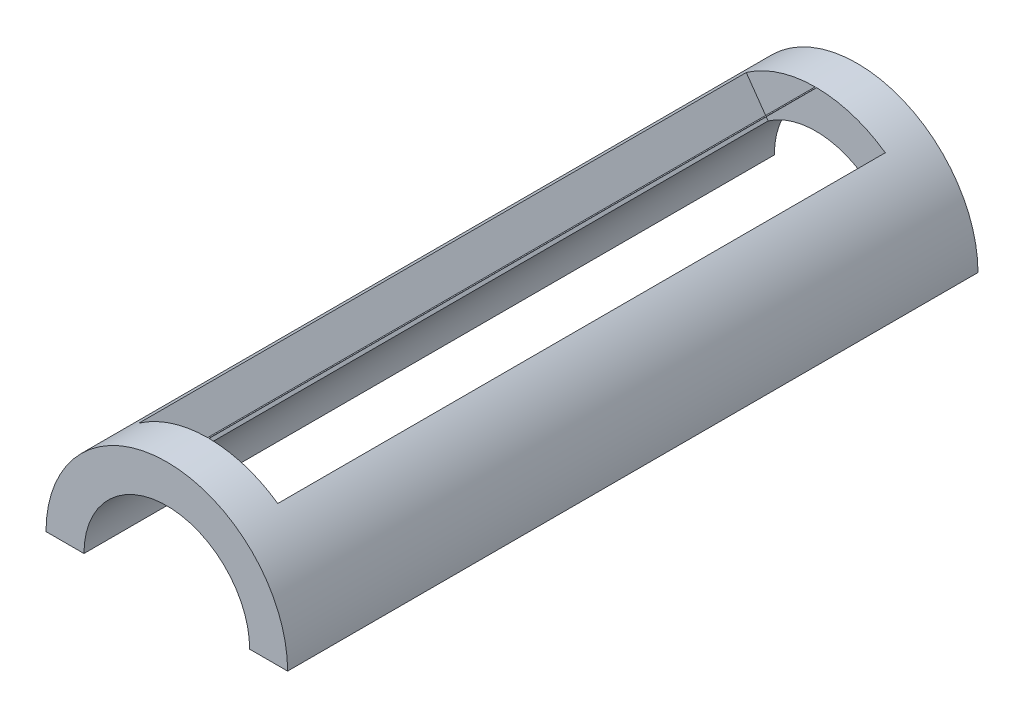
ISO-10303-21;
HEADER;
FILE_DESCRIPTION(('STEP AP214'),'2;1');
FILE_NAME('part.step','',(''),(''),'','','');
FILE_SCHEMA(('AUTOMOTIVE_DESIGN { 1 0 10303 214 1 1 1 1 }'));
ENDSEC;
DATA;
#1=APPLICATION_CONTEXT('core data for automotive mechanical design processes');
#2=APPLICATION_PROTOCOL_DEFINITION('international standard','automotive_design',2000,#1);
#3=PRODUCT_CONTEXT('',#1,'mechanical');
#4=PRODUCT('Part','Part','',(#3));
#5=PRODUCT_RELATED_PRODUCT_CATEGORY('part','',(#4));
#6=PRODUCT_DEFINITION_FORMATION('','',#4);
#7=PRODUCT_DEFINITION_CONTEXT('part definition',#1,'design');
#8=PRODUCT_DEFINITION('design','',#6,#7);
#9=PRODUCT_DEFINITION_SHAPE('','',#8);
#10=(LENGTH_UNIT() NAMED_UNIT(*) SI_UNIT(.MILLI.,.METRE.));
#11=(NAMED_UNIT(*) PLANE_ANGLE_UNIT() SI_UNIT($,.RADIAN.));
#12=(NAMED_UNIT(*) SI_UNIT($,.STERADIAN.) SOLID_ANGLE_UNIT());
#13=UNCERTAINTY_MEASURE_WITH_UNIT(LENGTH_MEASURE(1.E-05),#10,'distance_accuracy_value','');
#14=(GEOMETRIC_REPRESENTATION_CONTEXT(3) GLOBAL_UNCERTAINTY_ASSIGNED_CONTEXT((#13)) GLOBAL_UNIT_ASSIGNED_CONTEXT((#10,
#11,#12)) REPRESENTATION_CONTEXT('',''));
#15=CARTESIAN_POINT('',(0.,0.,0.));
#16=DIRECTION('',(0.,0.,1.));
#17=DIRECTION('',(1.,0.,0.));
#18=AXIS2_PLACEMENT_3D('',#15,#16,#17);
#19=CARTESIAN_POINT('',(0.,0.,-50.));
#20=DIRECTION('',(0.,0.,1.));
#21=DIRECTION('',(-1.,0.,0.));
#22=AXIS2_PLACEMENT_3D('',#19,#20,#21);
#23=CYLINDRICAL_SURFACE('',#22,12.);
#24=CARTESIAN_POINT('',(0.,0.,50.));
#25=DIRECTION('',(0.,0.,-1.));
#26=DIRECTION('',(1.,0.,0.));
#27=AXIS2_PLACEMENT_3D('',#24,#25,#26);
#28=CIRCLE('',#27,12.);
#29=CARTESIAN_POINT('',(-12.,0.,50.));
#30=VERTEX_POINT('',#29);
#31=CARTESIAN_POINT('',(12.,0.,50.));
#32=VERTEX_POINT('',#31);
#33=EDGE_CURVE('E183',#30,#32,#28,.T.);
#34=ORIENTED_EDGE('',*,*,#33,.F.);
#35=DIRECTION('',(0.,0.,1.));
#36=VECTOR('',#35,1.);
#37=CARTESIAN_POINT('',(-12.,0.,-50.));
#38=LINE('',#37,#36);
#39=CARTESIAN_POINT('',(-12.,0.,-50.));
#40=VERTEX_POINT('',#39);
#41=EDGE_CURVE('E192',#40,#30,#38,.T.);
#42=ORIENTED_EDGE('',*,*,#41,.F.);
#43=CARTESIAN_POINT('',(0.,0.,-50.));
#44=DIRECTION('',(0.,0.,-1.));
#45=DIRECTION('',(1.,0.,0.));
#46=AXIS2_PLACEMENT_3D('',#43,#44,#45);
#47=CIRCLE('',#46,12.);
#48=CARTESIAN_POINT('',(12.,0.,-50.));
#49=VERTEX_POINT('',#48);
#50=EDGE_CURVE('E172',#40,#49,#47,.T.);
#51=ORIENTED_EDGE('',*,*,#50,.T.);
#52=DIRECTION('',(0.,0.,1.));
#53=VECTOR('',#52,1.);
#54=CARTESIAN_POINT('',(12.,0.,-50.));
#55=LINE('',#54,#53);
#56=EDGE_CURVE('E189',#49,#32,#55,.T.);
#57=ORIENTED_EDGE('',*,*,#56,.T.);
#58=EDGE_LOOP('',(#34,#42,#51,#57));
#59=FACE_BOUND('',#58,.T.);
#60=DIRECTION('',(0.,0.,1.));
#61=VECTOR('',#60,1.);
#62=CARTESIAN_POINT('',(6.90505028343565,9.81428961174599,-50.));
#63=LINE('',#62,#61);
#64=CARTESIAN_POINT('',(6.90505028343565,9.81428961174599,44.));
#65=VERTEX_POINT('',#64);
#66=CARTESIAN_POINT('',(6.90505028343565,9.81428961174599,-44.));
#67=VERTEX_POINT('',#66);
#68=EDGE_CURVE('E11',#65,#67,#63,.F.);
#69=ORIENTED_EDGE('',*,*,#68,.T.);
#70=CARTESIAN_POINT('',(0.,0.,-44.));
#71=DIRECTION('',(0.,0.,1.));
#72=DIRECTION('',(1.,0.,0.));
#73=AXIS2_PLACEMENT_3D('',#70,#71,#72);
#74=CIRCLE('',#73,12.);
#75=CARTESIAN_POINT('',(-6.90505028343565,9.81428961174599,-44.));
#76=VERTEX_POINT('',#75);
#77=EDGE_CURVE('E201',#76,#67,#74,.F.);
#78=ORIENTED_EDGE('',*,*,#77,.F.);
#79=DIRECTION('',(0.,0.,1.));
#80=VECTOR('',#79,1.);
#81=CARTESIAN_POINT('',(-6.90505028343565,9.81428961174599,-50.));
#82=LINE('',#81,#80);
#83=CARTESIAN_POINT('',(-6.90505028343565,9.81428961174599,44.));
#84=VERTEX_POINT('',#83);
#85=EDGE_CURVE('E198',#76,#84,#82,.T.);
#86=ORIENTED_EDGE('',*,*,#85,.T.);
#87=CARTESIAN_POINT('',(0.,0.,44.));
#88=DIRECTION('',(0.,0.,1.));
#89=DIRECTION('',(1.,0.,0.));
#90=AXIS2_PLACEMENT_3D('',#87,#88,#89);
#91=CIRCLE('',#90,12.);
#92=EDGE_CURVE('E43',#84,#65,#91,.F.);
#93=ORIENTED_EDGE('',*,*,#92,.T.);
#94=EDGE_LOOP('',(#69,#78,#86,#93));
#95=FACE_BOUND('',#94,.T.);
#96=ADVANCED_FACE('F35',(#59,#95),#23,.F.);
#97=CARTESIAN_POINT('',(0.,0.,-50.));
#98=DIRECTION('',(0.,0.,1.));
#99=DIRECTION('',(-1.,0.,0.));
#100=AXIS2_PLACEMENT_3D('',#97,#98,#99);
#101=CYLINDRICAL_SURFACE('',#100,17.5);
#102=CARTESIAN_POINT('',(0.,0.,44.));
#103=DIRECTION('',(0.,0.,1.));
#104=DIRECTION('',(1.,0.,0.));
#105=AXIS2_PLACEMENT_3D('',#102,#103,#104);
#106=CIRCLE('',#105,17.5);
#107=CARTESIAN_POINT('',(10.069864996677,14.3125056837962,44.));
#108=VERTEX_POINT('',#107);
#109=CARTESIAN_POINT('',(0.0852782257723516,17.499792216601,44.));
#110=VERTEX_POINT('',#109);
#111=EDGE_CURVE('E165',#108,#110,#106,.T.);
#112=ORIENTED_EDGE('',*,*,#111,.T.);
#113=DIRECTION('',(0.,0.,-1.));
#114=VECTOR('',#113,1.);
#115=CARTESIAN_POINT('',(0.0852782257723533,17.499792216601,44.));
#116=LINE('',#115,#114);
#117=CARTESIAN_POINT('',(0.0852782257723544,17.499792216601,-44.));
#118=VERTEX_POINT('',#117);
#119=EDGE_CURVE('E129',#110,#118,#116,.T.);
#120=ORIENTED_EDGE('',*,*,#119,.T.);
#121=CARTESIAN_POINT('',(0.,0.,-44.));
#122=DIRECTION('',(0.,0.,1.));
#123=DIRECTION('',(1.,0.,0.));
#124=AXIS2_PLACEMENT_3D('',#121,#122,#123);
#125=CIRCLE('',#124,17.5);
#126=CARTESIAN_POINT('',(10.069864996677,14.3125056837962,-44.));
#127=VERTEX_POINT('',#126);
#128=EDGE_CURVE('E163',#127,#118,#125,.T.);
#129=ORIENTED_EDGE('',*,*,#128,.F.);
#130=DIRECTION('',(0.,0.,-1.));
#131=VECTOR('',#130,1.);
#132=CARTESIAN_POINT('',(10.069864996677,14.3125056837962,44.));
#133=LINE('',#132,#131);
#134=EDGE_CURVE('E130',#108,#127,#133,.T.);
#135=ORIENTED_EDGE('',*,*,#134,.F.);
#136=EDGE_LOOP('',(#112,#120,#129,#135));
#137=FACE_BOUND('',#136,.T.);
#138=CARTESIAN_POINT('',(-0.0852782257723551,17.499792216601,44.));
#139=VERTEX_POINT('',#138);
#140=CARTESIAN_POINT('',(-10.069864996677,14.3125056837962,44.));
#141=VERTEX_POINT('',#140);
#142=EDGE_CURVE('E143',#139,#141,#106,.T.);
#143=ORIENTED_EDGE('',*,*,#142,.T.);
#144=DIRECTION('',(0.,0.,-1.));
#145=VECTOR('',#144,1.);
#146=CARTESIAN_POINT('',(-10.069864996677,14.3125056837962,44.));
#147=LINE('',#146,#145);
#148=CARTESIAN_POINT('',(-10.069864996677,14.3125056837962,-44.));
#149=VERTEX_POINT('',#148);
#150=EDGE_CURVE('E138',#141,#149,#147,.T.);
#151=ORIENTED_EDGE('',*,*,#150,.T.);
#152=CARTESIAN_POINT('',(-0.0852782257723551,17.499792216601,-44.));
#153=VERTEX_POINT('',#152);
#154=EDGE_CURVE('E160',#153,#149,#125,.T.);
#155=ORIENTED_EDGE('',*,*,#154,.F.);
#156=DIRECTION('',(0.,0.,-1.));
#157=VECTOR('',#156,1.);
#158=CARTESIAN_POINT('',(-0.0852782257723585,17.499792216601,44.));
#159=LINE('',#158,#157);
#160=EDGE_CURVE('E158',#153,#139,#159,.F.);
#161=ORIENTED_EDGE('',*,*,#160,.T.);
#162=EDGE_LOOP('',(#143,#151,#155,#161));
#163=FACE_BOUND('',#162,.T.);
#164=CARTESIAN_POINT('',(0.,0.,50.));
#165=DIRECTION('',(0.,0.,1.));
#166=DIRECTION('',(1.,0.,0.));
#167=AXIS2_PLACEMENT_3D('',#164,#165,#166);
#168=CIRCLE('',#167,17.5);
#169=CARTESIAN_POINT('',(17.5,0.,50.));
#170=VERTEX_POINT('',#169);
#171=CARTESIAN_POINT('',(-17.5,0.,50.));
#172=VERTEX_POINT('',#171);
#173=EDGE_CURVE('E178',#170,#172,#168,.T.);
#174=ORIENTED_EDGE('',*,*,#173,.F.);
#175=DIRECTION('',(0.,0.,1.));
#176=VECTOR('',#175,1.);
#177=CARTESIAN_POINT('',(17.5,0.,-50.));
#178=LINE('',#177,#176);
#179=CARTESIAN_POINT('',(17.5,0.,-50.));
#180=VERTEX_POINT('',#179);
#181=EDGE_CURVE('E177',#180,#170,#178,.T.);
#182=ORIENTED_EDGE('',*,*,#181,.F.);
#183=CARTESIAN_POINT('',(0.,0.,-50.));
#184=DIRECTION('',(0.,0.,1.));
#185=DIRECTION('',(1.,0.,0.));
#186=AXIS2_PLACEMENT_3D('',#183,#184,#185);
#187=CIRCLE('',#186,17.5);
#188=CARTESIAN_POINT('',(-17.5,0.,-50.));
#189=VERTEX_POINT('',#188);
#190=EDGE_CURVE('E166',#180,#189,#187,.T.);
#191=ORIENTED_EDGE('',*,*,#190,.T.);
#192=DIRECTION('',(0.,0.,1.));
#193=VECTOR('',#192,1.);
#194=CARTESIAN_POINT('',(-17.5,0.,-50.));
#195=LINE('',#194,#193);
#196=EDGE_CURVE('E195',#189,#172,#195,.T.);
#197=ORIENTED_EDGE('',*,*,#196,.T.);
#198=EDGE_LOOP('',(#174,#182,#191,#197));
#199=FACE_BOUND('',#198,.T.);
#200=ADVANCED_FACE('F37',(#137,#163,#199),#101,.T.);
#201=CARTESIAN_POINT('',(-12.,0.,-50.));
#202=DIRECTION('',(0.,1.,0.));
#203=DIRECTION('',(0.,0.,-1.));
#204=AXIS2_PLACEMENT_3D('',#201,#202,#203);
#205=PLANE('',#204);
#206=DIRECTION('',(1.,0.,0.));
#207=VECTOR('',#206,1.);
#208=CARTESIAN_POINT('',(-12.,0.,50.));
#209=LINE('',#208,#207);
#210=EDGE_CURVE('E181',#172,#30,#209,.T.);
#211=ORIENTED_EDGE('',*,*,#210,.F.);
#212=ORIENTED_EDGE('',*,*,#196,.F.);
#213=DIRECTION('',(1.,0.,0.));
#214=VECTOR('',#213,1.);
#215=CARTESIAN_POINT('',(-12.,0.,-50.));
#216=LINE('',#215,#214);
#217=EDGE_CURVE('E169',#189,#40,#216,.T.);
#218=ORIENTED_EDGE('',*,*,#217,.T.);
#219=ORIENTED_EDGE('',*,*,#41,.T.);
#220=EDGE_LOOP('',(#211,#212,#218,#219));
#221=FACE_BOUND('',#220,.T.);
#222=ADVANCED_FACE('F218',(#221),#205,.F.);
#223=CARTESIAN_POINT('',(17.5,0.,-50.));
#224=DIRECTION('',(0.,1.,0.));
#225=DIRECTION('',(0.,0.,-1.));
#226=AXIS2_PLACEMENT_3D('',#223,#224,#225);
#227=PLANE('',#226);
#228=DIRECTION('',(1.,0.,0.));
#229=VECTOR('',#228,1.);
#230=CARTESIAN_POINT('',(17.5,0.,50.));
#231=LINE('',#230,#229);
#232=EDGE_CURVE('E170',#32,#170,#231,.T.);
#233=ORIENTED_EDGE('',*,*,#232,.F.);
#234=ORIENTED_EDGE('',*,*,#56,.F.);
#235=DIRECTION('',(1.,0.,0.));
#236=VECTOR('',#235,1.);
#237=CARTESIAN_POINT('',(17.5,0.,-50.));
#238=LINE('',#237,#236);
#239=EDGE_CURVE('E175',#49,#180,#238,.T.);
#240=ORIENTED_EDGE('',*,*,#239,.T.);
#241=ORIENTED_EDGE('',*,*,#181,.T.);
#242=EDGE_LOOP('',(#233,#234,#240,#241));
#243=FACE_BOUND('',#242,.T.);
#244=ADVANCED_FACE('F228',(#243),#227,.F.);
#245=CARTESIAN_POINT('',(0.,0.,-50.));
#246=DIRECTION('',(0.,0.,-1.));
#247=DIRECTION('',(1.,0.,0.));
#248=AXIS2_PLACEMENT_3D('',#245,#246,#247);
#249=PLANE('',#248);
#250=ORIENTED_EDGE('',*,*,#190,.F.);
#251=ORIENTED_EDGE('',*,*,#239,.F.);
#252=ORIENTED_EDGE('',*,*,#50,.F.);
#253=ORIENTED_EDGE('',*,*,#217,.F.);
#254=EDGE_LOOP('',(#250,#251,#252,#253));
#255=FACE_BOUND('',#254,.T.);
#256=ADVANCED_FACE('F232',(#255),#249,.T.);
#257=CARTESIAN_POINT('',(0.,0.,50.));
#258=DIRECTION('',(0.,0.,-1.));
#259=DIRECTION('',(1.,0.,0.));
#260=AXIS2_PLACEMENT_3D('',#257,#258,#259);
#261=PLANE('',#260);
#262=ORIENTED_EDGE('',*,*,#173,.T.);
#263=ORIENTED_EDGE('',*,*,#210,.T.);
#264=ORIENTED_EDGE('',*,*,#33,.T.);
#265=ORIENTED_EDGE('',*,*,#232,.T.);
#266=EDGE_LOOP('',(#262,#263,#264,#265));
#267=FACE_BOUND('',#266,.T.);
#268=ADVANCED_FACE('F224',(#267),#261,.F.);
#269=CARTESIAN_POINT('',(0.,0.,44.));
#270=DIRECTION('',(0.,0.,-1.));
#271=DIRECTION('',(1.,0.,0.));
#272=AXIS2_PLACEMENT_3D('',#269,#270,#271);
#273=PLANE('',#272);
#274=ORIENTED_EDGE('',*,*,#111,.F.);
#275=DIRECTION('',(-0.575420856952971,-0.817857467645499,0.));
#276=VECTOR('',#275,1.);
#277=CARTESIAN_POINT('',(10.069864996677,14.3125056837962,44.));
#278=LINE('',#277,#276);
#279=EDGE_CURVE('E139',#108,#65,#278,.T.);
#280=ORIENTED_EDGE('',*,*,#279,.T.);
#281=ORIENTED_EDGE('',*,*,#92,.F.);
#282=DIRECTION('',(-0.575420856952971,0.817857467645499,0.));
#283=VECTOR('',#282,1.);
#284=CARTESIAN_POINT('',(0.,0.,44.));
#285=LINE('',#284,#283);
#286=EDGE_CURVE('E58',#84,#141,#285,.T.);
#287=ORIENTED_EDGE('',*,*,#286,.T.);
#288=ORIENTED_EDGE('',*,*,#142,.F.);
#289=DIRECTION('',(-0.575420856952971,0.817857467645499,0.));
#290=VECTOR('',#289,1.);
#291=CARTESIAN_POINT('',(8.17857467645499,5.75420856952971,44.));
#292=LINE('',#291,#290);
#293=CARTESIAN_POINT('',(0.,17.3785845249911,44.));
#294=VERTEX_POINT('',#293);
#295=EDGE_CURVE('E124',#294,#139,#292,.T.);
#296=ORIENTED_EDGE('',*,*,#295,.F.);
#297=DIRECTION('',(-0.575420856952971,-0.817857467645499,0.));
#298=VECTOR('',#297,1.);
#299=CARTESIAN_POINT('',(1.891290320222,20.0667142533259,44.));
#300=LINE('',#299,#298);
#301=EDGE_CURVE('E133',#110,#294,#300,.T.);
#302=ORIENTED_EDGE('',*,*,#301,.F.);
#303=EDGE_LOOP('',(#274,#280,#281,#287,#288,#296,#302));
#304=FACE_BOUND('',#303,.T.);
#305=ADVANCED_FACE('F141',(#304),#273,.T.);
#306=CARTESIAN_POINT('',(0.,0.,-44.));
#307=DIRECTION('',(0.,0.,-1.));
#308=DIRECTION('',(1.,0.,0.));
#309=AXIS2_PLACEMENT_3D('',#306,#307,#308);
#310=PLANE('',#309);
#311=DIRECTION('',(-0.575420856952971,-0.817857467645499,0.));
#312=VECTOR('',#311,1.);
#313=CARTESIAN_POINT('',(10.069864996677,14.3125056837962,-44.));
#314=LINE('',#313,#312);
#315=EDGE_CURVE('E50',#127,#67,#314,.T.);
#316=ORIENTED_EDGE('',*,*,#315,.F.);
#317=ORIENTED_EDGE('',*,*,#128,.T.);
#318=DIRECTION('',(-0.575420856952971,-0.817857467645499,0.));
#319=VECTOR('',#318,1.);
#320=CARTESIAN_POINT('',(1.891290320222,20.0667142533259,-44.));
#321=LINE('',#320,#319);
#322=CARTESIAN_POINT('',(0.,17.3785845249911,-44.));
#323=VERTEX_POINT('',#322);
#324=EDGE_CURVE('E144',#118,#323,#321,.T.);
#325=ORIENTED_EDGE('',*,*,#324,.T.);
#326=DIRECTION('',(-0.575420856952971,0.817857467645499,0.));
#327=VECTOR('',#326,1.);
#328=CARTESIAN_POINT('',(8.17857467645499,5.75420856952971,-44.));
#329=LINE('',#328,#327);
#330=EDGE_CURVE('E126',#323,#153,#329,.T.);
#331=ORIENTED_EDGE('',*,*,#330,.T.);
#332=ORIENTED_EDGE('',*,*,#154,.T.);
#333=DIRECTION('',(-0.575420856952971,0.817857467645499,0.));
#334=VECTOR('',#333,1.);
#335=CARTESIAN_POINT('',(0.,0.,-44.));
#336=LINE('',#335,#334);
#337=EDGE_CURVE('E151',#76,#149,#336,.T.);
#338=ORIENTED_EDGE('',*,*,#337,.F.);
#339=ORIENTED_EDGE('',*,*,#77,.T.);
#340=EDGE_LOOP('',(#316,#317,#325,#331,#332,#338,#339));
#341=FACE_BOUND('',#340,.T.);
#342=ADVANCED_FACE('F211',(#341),#310,.F.);
#343=CARTESIAN_POINT('',(10.069864996677,14.3125056837962,44.));
#344=DIRECTION('',(-0.817857467645499,0.575420856952971,0.));
#345=DIRECTION('',(-0.575420856952971,-0.817857467645499,0.));
#346=AXIS2_PLACEMENT_3D('',#343,#344,#345);
#347=PLANE('',#346);
#348=ORIENTED_EDGE('',*,*,#68,.F.);
#349=ORIENTED_EDGE('',*,*,#279,.F.);
#350=ORIENTED_EDGE('',*,*,#134,.T.);
#351=ORIENTED_EDGE('',*,*,#315,.T.);
#352=EDGE_LOOP('',(#348,#349,#350,#351));
#353=FACE_BOUND('',#352,.T.);
#354=ADVANCED_FACE('F208',(#353),#347,.T.);
#355=CARTESIAN_POINT('',(0.,0.,44.));
#356=DIRECTION('',(0.817857467645499,0.575420856952971,0.));
#357=DIRECTION('',(-0.575420856952971,0.817857467645499,0.));
#358=AXIS2_PLACEMENT_3D('',#355,#356,#357);
#359=PLANE('',#358);
#360=ORIENTED_EDGE('',*,*,#85,.F.);
#361=ORIENTED_EDGE('',*,*,#337,.T.);
#362=ORIENTED_EDGE('',*,*,#150,.F.);
#363=ORIENTED_EDGE('',*,*,#286,.F.);
#364=EDGE_LOOP('',(#360,#361,#362,#363));
#365=FACE_BOUND('',#364,.T.);
#366=ADVANCED_FACE('F214',(#365),#359,.T.);
#367=CARTESIAN_POINT('',(8.17857467645499,5.75420856952971,44.));
#368=DIRECTION('',(0.817857467645499,0.575420856952971,0.));
#369=DIRECTION('',(-0.575420856952971,0.817857467645499,0.));
#370=AXIS2_PLACEMENT_3D('',#367,#368,#369);
#371=PLANE('',#370);
#372=ORIENTED_EDGE('',*,*,#160,.F.);
#373=ORIENTED_EDGE('',*,*,#330,.F.);
#374=DIRECTION('',(0.,0.,-1.));
#375=VECTOR('',#374,1.);
#376=CARTESIAN_POINT('',(0.,17.3785845249911,44.));
#377=LINE('',#376,#375);
#378=EDGE_CURVE('E119',#294,#323,#377,.T.);
#379=ORIENTED_EDGE('',*,*,#378,.F.);
#380=ORIENTED_EDGE('',*,*,#295,.T.);
#381=EDGE_LOOP('',(#372,#373,#379,#380));
#382=FACE_BOUND('',#381,.T.);
#383=ADVANCED_FACE('F122',(#382),#371,.F.);
#384=CARTESIAN_POINT('',(1.891290320222,20.0667142533259,44.));
#385=DIRECTION('',(-0.817857467645499,0.575420856952971,0.));
#386=DIRECTION('',(-0.575420856952971,-0.817857467645499,0.));
#387=AXIS2_PLACEMENT_3D('',#384,#385,#386);
#388=PLANE('',#387);
#389=ORIENTED_EDGE('',*,*,#119,.F.);
#390=ORIENTED_EDGE('',*,*,#301,.T.);
#391=ORIENTED_EDGE('',*,*,#378,.T.);
#392=ORIENTED_EDGE('',*,*,#324,.F.);
#393=EDGE_LOOP('',(#389,#390,#391,#392));
#394=FACE_BOUND('',#393,.T.);
#395=ADVANCED_FACE('F134',(#394),#388,.F.);
#396=CLOSED_SHELL('',(#96,#200,#222,#244,#256,#268,#305,#342,#354,#366,#383,#395));
#397=MANIFOLD_SOLID_BREP('B2',#396);
#398=ADVANCED_BREP_SHAPE_REPRESENTATION('',(#18,#397),#14);
#399=SHAPE_DEFINITION_REPRESENTATION(#9,#398);
ENDSEC;
END-ISO-10303-21;
